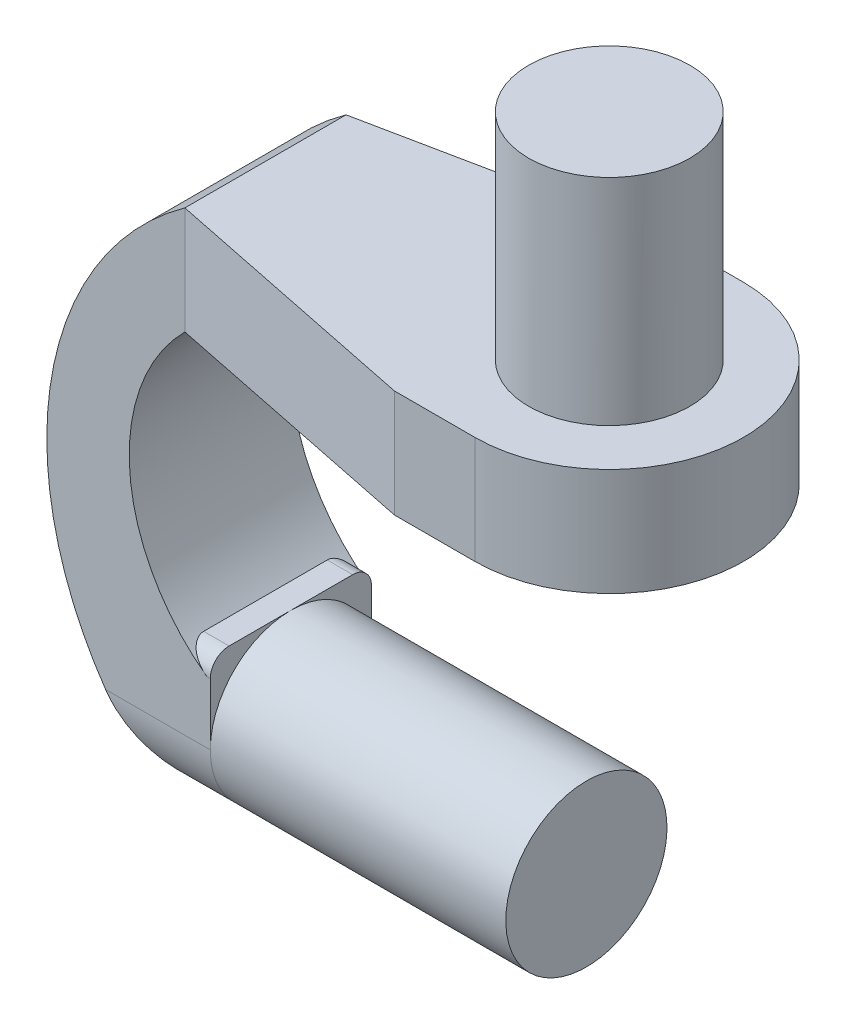
ISO-10303-21;
HEADER;
FILE_DESCRIPTION(('STEP AP214'),'2;1');
FILE_NAME('part.step','',(''),(''),'','','');
FILE_SCHEMA(('AUTOMOTIVE_DESIGN { 1 0 10303 214 1 1 1 1 }'));
ENDSEC;
DATA;
#1=APPLICATION_CONTEXT('core data for automotive mechanical design processes');
#2=APPLICATION_PROTOCOL_DEFINITION('international standard','automotive_design',2000,#1);
#3=PRODUCT_CONTEXT('',#1,'mechanical');
#4=PRODUCT('Part','Part','',(#3));
#5=PRODUCT_RELATED_PRODUCT_CATEGORY('part','',(#4));
#6=PRODUCT_DEFINITION_FORMATION('','',#4);
#7=PRODUCT_DEFINITION_CONTEXT('part definition',#1,'design');
#8=PRODUCT_DEFINITION('design','',#6,#7);
#9=PRODUCT_DEFINITION_SHAPE('','',#8);
#10=(LENGTH_UNIT() NAMED_UNIT(*) SI_UNIT(.MILLI.,.METRE.));
#11=(NAMED_UNIT(*) PLANE_ANGLE_UNIT() SI_UNIT($,.RADIAN.));
#12=(NAMED_UNIT(*) SI_UNIT($,.STERADIAN.) SOLID_ANGLE_UNIT());
#13=UNCERTAINTY_MEASURE_WITH_UNIT(LENGTH_MEASURE(1.E-05),#10,'distance_accuracy_value','');
#14=(GEOMETRIC_REPRESENTATION_CONTEXT(3) GLOBAL_UNCERTAINTY_ASSIGNED_CONTEXT((#13)) GLOBAL_UNIT_ASSIGNED_CONTEXT((#10,
#11,#12)) REPRESENTATION_CONTEXT('',''));
#15=CARTESIAN_POINT('',(0.,0.,0.));
#16=DIRECTION('',(0.,0.,1.));
#17=DIRECTION('',(1.,0.,0.));
#18=AXIS2_PLACEMENT_3D('',#15,#16,#17);
#19=CARTESIAN_POINT('',(4.73017455908226,0.,30.));
#20=DIRECTION('',(-1.,0.,0.));
#21=DIRECTION('',(0.,-1.,0.));
#22=AXIS2_PLACEMENT_3D('',#19,#20,#21);
#23=PLANE('',#22);
#24=DIRECTION('',(0.,0.,-1.));
#25=VECTOR('',#24,1.);
#26=CARTESIAN_POINT('',(4.73017455908226,0.,30.));
#27=LINE('',#26,#25);
#28=CARTESIAN_POINT('',(4.73017455908226,0.,26.5));
#29=VERTEX_POINT('',#28);
#30=CARTESIAN_POINT('',(4.73017455908226,0.,15.));
#31=VERTEX_POINT('',#30);
#32=EDGE_CURVE('E224',#29,#31,#27,.T.);
#33=ORIENTED_EDGE('',*,*,#32,.F.);
#34=CARTESIAN_POINT('',(4.73017455908226,-3.5,26.5));
#35=DIRECTION('',(-1.,0.,0.));
#36=DIRECTION('',(0.,-1.,0.));
#37=AXIS2_PLACEMENT_3D('',#34,#35,#36);
#38=CIRCLE('',#37,3.5);
#39=CARTESIAN_POINT('',(4.73017455908226,-3.5,30.));
#40=VERTEX_POINT('',#39);
#41=EDGE_CURVE('E243',#29,#40,#38,.F.);
#42=ORIENTED_EDGE('',*,*,#41,.T.);
#43=DIRECTION('',(0.,1.,0.));
#44=VECTOR('',#43,1.);
#45=CARTESIAN_POINT('',(4.73017455908226,0.,30.));
#46=LINE('',#45,#44);
#47=CARTESIAN_POINT('',(4.73017455908226,-15.,30.));
#48=VERTEX_POINT('',#47);
#49=EDGE_CURVE('E208',#48,#40,#46,.T.);
#50=ORIENTED_EDGE('',*,*,#49,.F.);
#51=CARTESIAN_POINT('',(4.73017455908226,-15.,15.));
#52=DIRECTION('',(1.,0.,0.));
#53=DIRECTION('',(0.,1.,0.));
#54=AXIS2_PLACEMENT_3D('',#51,#52,#53);
#55=CIRCLE('',#54,15.);
#56=EDGE_CURVE('E197',#31,#48,#55,.T.);
#57=ORIENTED_EDGE('',*,*,#56,.F.);
#58=EDGE_LOOP('',(#33,#42,#50,#57));
#59=FACE_BOUND('',#58,.T.);
#60=ADVANCED_FACE('F41',(#59),#23,.F.);
#61=CARTESIAN_POINT('',(25.,25.,30.));
#62=DIRECTION('',(0.,0.,-1.));
#63=DIRECTION('',(-1.,0.,0.));
#64=AXIS2_PLACEMENT_3D('',#61,#62,#63);
#65=CYLINDRICAL_SURFACE('',#64,35.3553390593274);
#66=CARTESIAN_POINT('',(25.,25.,0.));
#67=DIRECTION('',(0.,0.,-1.));
#68=DIRECTION('',(-1.,0.,0.));
#69=AXIS2_PLACEMENT_3D('',#66,#67,#68);
#70=CIRCLE('',#69,35.3553390593274);
#71=CARTESIAN_POINT('',(4.07752404709232,-3.5,0.));
#72=VERTEX_POINT('',#71);
#73=CARTESIAN_POINT('',(0.,50.,0.));
#74=VERTEX_POINT('',#73);
#75=EDGE_CURVE('E196',#72,#74,#70,.T.);
#76=ORIENTED_EDGE('',*,*,#75,.T.);
#77=DIRECTION('',(0.,0.,-1.));
#78=VECTOR('',#77,1.);
#79=CARTESIAN_POINT('',(0.,50.,30.));
#80=LINE('',#79,#78);
#81=CARTESIAN_POINT('',(0.,50.,30.));
#82=VERTEX_POINT('',#81);
#83=EDGE_CURVE('E229',#82,#74,#80,.T.);
#84=ORIENTED_EDGE('',*,*,#83,.F.);
#85=CARTESIAN_POINT('',(25.,25.,30.));
#86=DIRECTION('',(0.,0.,-1.));
#87=DIRECTION('',(-1.,0.,0.));
#88=AXIS2_PLACEMENT_3D('',#85,#86,#87);
#89=CIRCLE('',#88,35.3553390593274);
#90=CARTESIAN_POINT('',(4.07752404709232,-3.5,30.));
#91=VERTEX_POINT('',#90);
#92=EDGE_CURVE('E202',#91,#82,#89,.T.);
#93=ORIENTED_EDGE('',*,*,#92,.F.);
#94=CARTESIAN_POINT('',(4.07752404709232,-3.5,30.));
#95=CARTESIAN_POINT('',(3.98138738331284,-3.42942458306522,29.9999953331386));
#96=CARTESIAN_POINT('',(3.8856156408943,-3.35836691976016,29.9978654151781));
#97=CARTESIAN_POINT('',(3.69490324020333,-3.21536922700709,29.9891438972232));
#98=CARTESIAN_POINT('',(3.59996278947417,-3.14342898740317,29.9825512134984));
#99=CARTESIAN_POINT('',(3.31587017385924,-2.92589285679172,29.9556936083779));
#100=CARTESIAN_POINT('',(3.12820211373673,-2.77913616114215,29.9283457232254));
#101=CARTESIAN_POINT('',(2.75572240551768,-2.4818075208272,29.8521917490812));
#102=CARTESIAN_POINT('',(2.5709924349927,-2.3312111545292,29.8030782725758));
#103=CARTESIAN_POINT('',(2.2095899156695,-2.03057936225102,29.6807362563524));
#104=CARTESIAN_POINT('',(2.0329022941179,-1.88054341531848,29.6075551372409));
#105=CARTESIAN_POINT('',(1.77771020464601,-1.65966304374609,29.4782923430573));
#106=CARTESIAN_POINT('',(1.69509658416937,-1.58746231836202,29.4325298352264));
#107=CARTESIAN_POINT('',(1.53289223171498,-1.44440517463277,29.334091741339));
#108=CARTESIAN_POINT('',(1.45330159692469,-1.37354879954436,29.2814159332656));
#109=CARTESIAN_POINT('',(1.22038653271812,-1.16434909253484,29.112800582105));
#110=CARTESIAN_POINT('',(1.07217920951994,-1.02873272390833,28.9859097761856));
#111=CARTESIAN_POINT('',(0.819370781800552,-0.793830467938925,28.7252749385377));
#112=CARTESIAN_POINT('',(0.711667979499445,-0.692327168667741,28.5965565099821));
#113=CARTESIAN_POINT('',(0.5136952433472,-0.503715718845871,28.3167645852262));
#114=CARTESIAN_POINT('',(0.423411937760383,-0.4165965340823,28.16570839479));
#115=CARTESIAN_POINT('',(0.281842690977172,-0.278852642851255,27.8763325244754));
#116=CARTESIAN_POINT('',(0.226351289366165,-0.224406204840851,27.7418998358952));
#117=CARTESIAN_POINT('',(0.132241678591598,-0.13163323187503,27.4621392735744));
#118=CARTESIAN_POINT('',(0.0935896206377331,-0.0932743651216748,27.3168339507169));
#119=CARTESIAN_POINT('',(0.0432727203375999,-0.0432156659698818,27.0593608332615));
#120=CARTESIAN_POINT('',(0.0271292823993584,-0.0271047470416255,26.9489123027056));
#121=CARTESIAN_POINT('',(0.0108963756090021,-0.0108926975859752,26.7815831182821));
#122=CARTESIAN_POINT('',(0.00681567922463498,-0.0068142811705022,26.725438952235));
#123=CARTESIAN_POINT('',(0.00136555582780911,-0.00136561544977088,26.6128680771393));
#124=CARTESIAN_POINT('',(-2.88679567981159E-06,3.65059255079361E-06,26.5564412729559));
#125=CARTESIAN_POINT('',(0.,0.,26.5));
#126=B_SPLINE_CURVE_WITH_KNOTS('',3,(#94,#95,#96,#97,#98,#99,#100,#101,#102,#103,#104,#105,#106,
#107,#108,#109,#110,#111,#112,#113,#114,#115,#116,#117,#118,#119,#120,#121,#122,#123,#124,#125),
.UNSPECIFIED.,.F.,.F.,(4,2,2,2,2,2,2,2,2,2,2,2,2,2,2,4),(0.,0.357740129426834,0.71556716304623,
1.43402470188671,2.16296918956532,2.89048595340967,3.24689996314408,3.6033254217251,
4.31306540898095,4.89943040188353,5.4853434765923,5.94937621896781,6.41247185577119,
6.74978320508651,6.91898442704675,7.08824704788529),.UNSPECIFIED.);
#127=CARTESIAN_POINT('',(0.,0.,26.5));
#128=VERTEX_POINT('',#127);
#129=EDGE_CURVE('E254',#91,#128,#126,.T.);
#130=ORIENTED_EDGE('',*,*,#129,.T.);
#131=DIRECTION('',(0.,0.,-1.));
#132=VECTOR('',#131,1.);
#133=CARTESIAN_POINT('',(0.,0.,30.));
#134=LINE('',#133,#132);
#135=CARTESIAN_POINT('',(0.,0.,3.5));
#136=VERTEX_POINT('',#135);
#137=EDGE_CURVE('E211',#128,#136,#134,.T.);
#138=ORIENTED_EDGE('',*,*,#137,.T.);
#139=CARTESIAN_POINT('',(0.,0.,3.5));
#140=CARTESIAN_POINT('',(-1.55281885477549E-05,1.87808856252323E-05,3.42247872036869));
#141=CARTESIAN_POINT('',(0.00257498377828729,-0.00257491223823699,3.34497031451016));
#142=CARTESIAN_POINT('',(0.0128481703146678,-0.0128434861670845,3.19068078664446));
#143=CARTESIAN_POINT('',(0.0205274496090057,-0.0205149790106605,3.1138992143093));
#144=CARTESIAN_POINT('',(0.0407802853757086,-0.0407176772621466,2.96224582513414));
#145=CARTESIAN_POINT('',(0.0533157080079729,-0.0532110153879446,2.88736385662995));
#146=CARTESIAN_POINT('',(0.0830602400109421,-0.0827939752061581,2.73947464043919));
#147=CARTESIAN_POINT('',(0.100269886791045,-0.0998841254054866,2.66646760937681));
#148=CARTESIAN_POINT('',(0.158439537996554,-0.157501010472901,2.45136708014097));
#149=CARTESIAN_POINT('',(0.206010451881759,-0.20444488105733,2.31268572430238));
#150=CARTESIAN_POINT('',(0.316306311826561,-0.312471706775321,2.0473086144525));
#151=CARTESIAN_POINT('',(0.379061612909263,-0.373582973492562,1.9206375852355));
#152=CARTESIAN_POINT('',(0.542915805309272,-0.531710437274315,1.63594177591007));
#153=CARTESIAN_POINT('',(0.649587324678243,-0.633618597419721,1.48383408757272));
#154=CARTESIAN_POINT('',(0.88069363463394,-0.85119796628913,1.20539428459331));
#155=CARTESIAN_POINT('',(1.00515332790182,-0.966888431201438,1.07909891877637));
#156=CARTESIAN_POINT('',(1.32359997465509,-1.25817941843804,0.801812752990653));
#157=CARTESIAN_POINT('',(1.52452806166125,-1.43821029876506,0.663427025648555));
#158=CARTESIAN_POINT('',(1.83932990417509,-1.71335354267966,0.488392447095978));
#159=CARTESIAN_POINT('',(1.94678384897571,-1.80615544973914,0.435380317415902));
#160=CARTESIAN_POINT('',(2.16540559278941,-1.99262559802932,0.339493400696824));
#161=CARTESIAN_POINT('',(2.27657238801956,-2.08629360023435,0.296615898641265));
#162=CARTESIAN_POINT('',(2.5243122319694,-2.29238626887166,0.212691676194992));
#163=CARTESIAN_POINT('',(2.6615476893279,-2.40484290041651,0.173698350232292));
#164=CARTESIAN_POINT('',(2.93952917163843,-2.62910684073955,0.10806926498445));
#165=CARTESIAN_POINT('',(3.08027674129598,-2.74091383615804,0.0814390479408818));
#166=CARTESIAN_POINT('',(3.36270819776118,-2.96174718461249,0.0398319095955325));
#167=CARTESIAN_POINT('',(3.50435802110077,-3.07079082388116,0.0247125787397852));
#168=CARTESIAN_POINT('',(3.78958996076149,-3.28693376417426,0.0048152390050554));
#169=CARTESIAN_POINT('',(3.93316953731037,-3.39403525399173,2.47650469227096E-05));
#170=CARTESIAN_POINT('',(4.07752404709232,-3.5,0.));
#171=B_SPLINE_CURVE_WITH_KNOTS('',3,(#139,#140,#141,#142,#143,#144,#145,#146,#147,#148,#149,
#150,#151,#152,#153,#154,#155,#156,#157,#158,#159,#160,#161,#162,#163,#164,#165,#166,#167,#168,
#169,#170),.UNSPECIFIED.,.F.,.F.,(4,2,2,2,2,2,2,2,2,2,2,2,2,2,2,4),(0.,0.232456170049013,
0.464757399024964,0.695270251421364,0.925809617790403,1.38535501588275,1.84582679099065,
2.47797011224983,3.11100723689507,4.01528326335595,4.46969491959077,4.92398470286714,
5.46846339792871,6.01318594148473,6.55105461095497,7.08827380517089),.UNSPECIFIED.);
#172=EDGE_CURVE('E245',#136,#72,#171,.T.);
#173=ORIENTED_EDGE('',*,*,#172,.T.);
#174=EDGE_LOOP('',(#76,#84,#93,#130,#138,#173));
#175=FACE_BOUND('',#174,.T.);
#176=ADVANCED_FACE('F261',(#175),#65,.F.);
#177=CARTESIAN_POINT('',(35.8085185395878,20.,30.));
#178=DIRECTION('',(0.,0.,-1.));
#179=DIRECTION('',(-1.,0.,0.));
#180=AXIS2_PLACEMENT_3D('',#177,#178,#179);
#181=CYLINDRICAL_SURFACE('',#180,61.5);
#182=CARTESIAN_POINT('',(35.8085185395878,20.,0.));
#183=DIRECTION('',(0.,0.,1.));
#184=DIRECTION('',(1.,0.,0.));
#185=AXIS2_PLACEMENT_3D('',#182,#183,#184);
#186=CIRCLE('',#185,61.5);
#187=CARTESIAN_POINT('',(0.,70.,0.));
#188=VERTEX_POINT('',#187);
#189=CARTESIAN_POINT('',(-14.7607408973469,-15.,0.));
#190=VERTEX_POINT('',#189);
#191=EDGE_CURVE('E217',#188,#190,#186,.T.);
#192=ORIENTED_EDGE('',*,*,#191,.T.);
#193=CARTESIAN_POINT('',(-14.7607408973469,-15.,0.));
#194=CARTESIAN_POINT('',(-14.5792200229492,-15.2622740154124,4.30827258697492E-06));
#195=CARTESIAN_POINT('',(-14.3956843677024,-15.5230854188652,0.00687871256496888));
#196=CARTESIAN_POINT('',(-14.0249397877896,-16.041335452944,0.0339392670614126));
#197=CARTESIAN_POINT('',(-13.8377313669971,-16.298774538254,0.0541236034719172));
#198=CARTESIAN_POINT('',(-13.2714317129944,-17.0649607565935,0.133948977383458));
#199=CARTESIAN_POINT('',(-12.8873039289826,-17.5680998429091,0.212864112890832));
#200=CARTESIAN_POINT('',(-12.109171077569,-18.5556762213086,0.41879635796991));
#201=CARTESIAN_POINT('',(-11.7151744777037,-19.0401286973664,0.545773466678897));
#202=CARTESIAN_POINT('',(-10.9198221002023,-19.9886897900152,0.845129434459807));
#203=CARTESIAN_POINT('',(-10.5184647183866,-20.4527938954083,1.01751830246465));
#204=CARTESIAN_POINT('',(-9.70659702743813,-21.3642516364997,1.4079015095403));
#205=CARTESIAN_POINT('',(-9.29603483042673,-21.8113301552955,1.62642905704888));
#206=CARTESIAN_POINT('',(-8.47396202934319,-22.6810254965548,2.10625993358674));
#207=CARTESIAN_POINT('',(-8.06245138637646,-23.1036412965817,2.36756504878986));
#208=CARTESIAN_POINT('',(-7.2421077883039,-23.9229989050268,2.93236362429304));
#209=CARTESIAN_POINT('',(-6.83327629771808,-24.3197274768928,3.23587842254483));
#210=CARTESIAN_POINT('',(-6.02310277728024,-25.0852050685383,3.88512262754386));
#211=CARTESIAN_POINT('',(-5.62175869659526,-25.4539618373449,4.23084027307785));
#212=CARTESIAN_POINT('',(-4.94083321265541,-26.0639578745998,4.86464257493412));
#213=CARTESIAN_POINT('',(-4.65810124976161,-26.3123905133148,5.14245480075327));
#214=CARTESIAN_POINT('',(-4.10237519877665,-26.7921492208275,5.72170856540481));
#215=CARTESIAN_POINT('',(-3.82938127689508,-27.0234749977161,6.02315050727042));
#216=CARTESIAN_POINT('',(-3.29690674652528,-27.4672057705777,6.65037969203437));
#217=CARTESIAN_POINT('',(-3.03741319053763,-27.679629039276,6.97614285113294));
#218=CARTESIAN_POINT('',(-2.53632429164099,-28.0835388414981,7.65313235524456));
#219=CARTESIAN_POINT('',(-2.294722246163,-28.2750332283841,8.00434906620936));
#220=CARTESIAN_POINT('',(-1.74869822555839,-28.7018024254323,8.87035917078829));
#221=CARTESIAN_POINT('',(-1.45458238137089,-28.9266601981175,9.39719802538942));
#222=CARTESIAN_POINT('',(-1.0621593450361,-29.2222529347345,10.2237316520174));
#223=CARTESIAN_POINT('',(-0.939652921307565,-29.313708084602,10.5047529740322));
#224=CARTESIAN_POINT('',(-0.713439387551994,-29.4814746901261,11.0787484079608));
#225=CARTESIAN_POINT('',(-0.609730445642269,-29.5577876215154,11.3717213517331));
#226=CARTESIAN_POINT('',(-0.434994483403972,-29.6856933267681,11.9334974392492));
#227=CARTESIAN_POINT('',(-0.36156595710297,-29.7391315856048,12.2011316162009));
#228=CARTESIAN_POINT('',(-0.233769854561648,-29.8318139851036,12.7432598062404));
#229=CARTESIAN_POINT('',(-0.179395505784152,-29.8710631692283,13.0177513447375));
#230=CARTESIAN_POINT('',(-0.0908354008029242,-29.9348520014036,13.5752806383744));
#231=CARTESIAN_POINT('',(-0.0569083005968508,-29.9592032476735,13.8583821572965));
#232=CARTESIAN_POINT('',(-0.0228368829536855,-29.9836387104858,14.2851830657752));
#233=CARTESIAN_POINT('',(-0.0142828527342088,-29.9897686834676,14.4279272781284));
#234=CARTESIAN_POINT('',(-0.00286147843481455,-29.9979508309009,14.7137730483488));
#235=CARTESIAN_POINT('',(5.31801812459891E-06,-30.000002612661,14.8568746392999));
#236=CARTESIAN_POINT('',(0.,-30.,15.));
#237=B_SPLINE_CURVE_WITH_KNOTS('',3,(#193,#194,#195,#196,#197,#198,#199,#200,#201,#202,#203,
#204,#205,#206,#207,#208,#209,#210,#211,#212,#213,#214,#215,#216,#217,#218,#219,#220,#221,#222,
#223,#224,#225,#226,#227,#228,#229,#230,#231,#232,#233,#234,#235,#236),.UNSPECIFIED.,.F.,.F.,(4,
2,2,2,2,2,2,2,2,2,2,2,2,2,2,2,2,2,2,2,2,4),(0.,0.95670430992796,1.913278273165,3.82452441798732,
5.73418336231653,7.64426355576484,9.5777611809543,11.5113395597808,13.4458989836832,
15.3799205044302,16.7824277080587,18.1849588383409,19.5861190935327,20.9867517584164,
22.9112977394849,23.8701408790852,24.8288905256482,25.6757624129488,26.5223329856052,
27.3793993372266,27.8086442513817,28.2379304957683),.UNSPECIFIED.);
#238=CARTESIAN_POINT('',(0.,-30.,15.));
#239=VERTEX_POINT('',#238);
#240=EDGE_CURVE('E62',#190,#239,#237,.T.);
#241=ORIENTED_EDGE('',*,*,#240,.T.);
#242=CARTESIAN_POINT('',(0.,-30.,15.));
#243=CARTESIAN_POINT('',(3.91535603408932E-06,-30.0000019226519,15.1326603857099));
#244=CARTESIAN_POINT('',(-0.00245819959606967,-29.9982396128154,15.2653019020884));
#245=CARTESIAN_POINT('',(-0.012272834885369,-29.9912088150983,15.5303003796544));
#246=CARTESIAN_POINT('',(-0.0196249620021606,-29.9859406091372,15.6626573628635));
#247=CARTESIAN_POINT('',(-0.0489279016345173,-29.964929207615,16.0586041334327));
#248=CARTESIAN_POINT('',(-0.0781255051440818,-29.9439791003435,16.3214317477849));
#249=CARTESIAN_POINT('',(-0.154547859397388,-29.8889769314415,16.8400143838505));
#250=CARTESIAN_POINT('',(-0.201571071213078,-29.8550713137052,17.0958153816526));
#251=CARTESIAN_POINT('',(-0.312379018872984,-29.7748473362706,17.6018351823594));
#252=CARTESIAN_POINT('',(-0.376169440542922,-29.7285247658299,17.8520520603816));
#253=CARTESIAN_POINT('',(-0.537569118598636,-29.6107278604999,18.4099415454994));
#254=CARTESIAN_POINT('',(-0.639659353283302,-29.5358449420387,18.7156008630672));
#255=CARTESIAN_POINT('',(-0.864729870600318,-29.3694482196701,19.3145938666294));
#256=CARTESIAN_POINT('',(-0.987725606486511,-29.2779221096682,19.6079182331461));
#257=CARTESIAN_POINT('',(-1.25188771519556,-29.079564599993,20.1825337151424));
#258=CARTESIAN_POINT('',(-1.39313141845338,-28.9726678319304,20.4637664100265));
#259=CARTESIAN_POINT('',(-1.69033891690908,-28.745468621903,21.0125096204444));
#260=CARTESIAN_POINT('',(-1.84629909839459,-28.6251694696634,21.2800234799396));
#261=CARTESIAN_POINT('',(-2.25481730174869,-28.3066236419429,21.9374402106189));
#262=CARTESIAN_POINT('',(-2.51538407457947,-28.1004094518331,22.31852974207));
#263=CARTESIAN_POINT('',(-3.05731056585344,-27.6635990134213,23.0507860508791));
#264=CARTESIAN_POINT('',(-3.33868089440391,-27.4329902973803,23.4019373599993));
#265=CARTESIAN_POINT('',(-3.91699903891987,-26.9497120975835,24.0761581949266));
#266=CARTESIAN_POINT('',(-4.21397096166888,-26.6970080477087,24.3991820836882));
#267=CARTESIAN_POINT('',(-4.81870023765981,-26.1718487051831,25.0177020850703));
#268=CARTESIAN_POINT('',(-5.12645697992192,-25.8993945304817,25.3131997536433));
#269=CARTESIAN_POINT('',(-5.86617709960482,-25.2305499684779,25.9834630617058));
#270=CARTESIAN_POINT('',(-6.30146780532165,-24.8259761558389,26.346437402743));
#271=CARTESIAN_POINT('',(-7.17930812722109,-23.9848465009011,27.0234781092075));
#272=CARTESIAN_POINT('',(-7.62186030758822,-23.5482791637817,27.3375267683991));
#273=CARTESIAN_POINT('',(-8.5081851784751,-22.6459752961185,27.9161090704618));
#274=CARTESIAN_POINT('',(-8.95195558734896,-22.1802767442277,28.1807054603027));
#275=CARTESIAN_POINT('',(-9.83666361183539,-21.2212658850746,28.6595377427686));
#276=CARTESIAN_POINT('',(-10.2776018455175,-20.727959847849,28.8737850133583));
#277=CARTESIAN_POINT('',(-11.0663786676998,-19.8156089786057,29.2125905318895));
#278=CARTESIAN_POINT('',(-11.415446235767,-19.4010783286302,29.3465027477494));
#279=CARTESIAN_POINT('',(-12.1070595722643,-18.5570346505139,29.5787187353596));
#280=CARTESIAN_POINT('',(-12.4496071650935,-18.1275259116748,29.677032611143));
#281=CARTESIAN_POINT('',(-13.1264266112635,-17.2548790487242,29.836179969362));
#282=CARTESIAN_POINT('',(-13.4606955288162,-16.8117362111419,29.8970003334464));
#283=CARTESIAN_POINT('',(-13.9543099452759,-16.1384632990158,29.9584342322085));
#284=CARTESIAN_POINT('',(-14.1176184109699,-15.9125136348844,29.9739463432488));
#285=CARTESIAN_POINT('',(-14.4413806098179,-15.4580810894631,29.9947284706117));
#286=CARTESIAN_POINT('',(-14.6018340662219,-15.2295979660398,29.9999974993238));
#287=CARTESIAN_POINT('',(-14.7607408973468,-15.,30.));
#288=B_SPLINE_CURVE_WITH_KNOTS('',3,(#242,#243,#244,#245,#246,#247,#248,#249,#250,#251,#252,
#253,#254,#255,#256,#257,#258,#259,#260,#261,#262,#263,#264,#265,#266,#267,#268,#269,#270,#271,
#272,#273,#274,#275,#276,#277,#278,#279,#280,#281,#282,#283,#284,#285,#286,#287),.UNSPECIFIED.,
.F.,.F.,(4,2,2,2,2,2,2,2,2,2,2,2,2,2,2,2,2,2,2,2,2,2,4),(0.,0.397909631650282,0.795787270072938,
1.59046056992976,2.3764049184766,3.16261612840148,4.15364319859418,5.14540604312748,
6.1415187647107,7.13738751871556,8.65187314845857,10.1671365873264,11.6848144462172,
13.2024064644282,15.2886947288665,17.3757362771624,19.4601114556852,21.5440151502568,
23.2174084620863,24.8903264343414,26.5638294008338,27.401300806987,28.23885295587),.UNSPECIFIED.);
#289=CARTESIAN_POINT('',(-14.7607408973469,-15.,30.));
#290=VERTEX_POINT('',#289);
#291=EDGE_CURVE('E57',#239,#290,#288,.T.);
#292=ORIENTED_EDGE('',*,*,#291,.T.);
#293=CARTESIAN_POINT('',(35.8085185395878,20.,30.));
#294=DIRECTION('',(0.,0.,1.));
#295=DIRECTION('',(1.,0.,0.));
#296=AXIS2_PLACEMENT_3D('',#293,#294,#295);
#297=CIRCLE('',#296,61.5);
#298=CARTESIAN_POINT('',(0.,70.,30.));
#299=VERTEX_POINT('',#298);
#300=EDGE_CURVE('E206',#299,#290,#297,.T.);
#301=ORIENTED_EDGE('',*,*,#300,.F.);
#302=DIRECTION('',(0.,0.,-1.));
#303=VECTOR('',#302,1.);
#304=CARTESIAN_POINT('',(0.,70.,30.));
#305=LINE('',#304,#303);
#306=EDGE_CURVE('E226',#299,#188,#305,.T.);
#307=ORIENTED_EDGE('',*,*,#306,.T.);
#308=EDGE_LOOP('',(#192,#241,#292,#301,#307));
#309=FACE_BOUND('',#308,.T.);
#310=ADVANCED_FACE('F289',(#309),#181,.T.);
#311=DIRECTION('',(0.,1.,0.));
#312=VECTOR('',#311,1.);
#313=CARTESIAN_POINT('',(4.73017455908226,0.,0.));
#314=LINE('',#313,#312);
#315=CARTESIAN_POINT('',(4.73017455908226,-15.,0.));
#316=VERTEX_POINT('',#315);
#317=CARTESIAN_POINT('',(4.73017455908226,-3.5,0.));
#318=VERTEX_POINT('',#317);
#319=EDGE_CURVE('E204',#316,#318,#314,.T.);
#320=ORIENTED_EDGE('',*,*,#319,.T.);
#321=CARTESIAN_POINT('',(4.73017455908226,-3.5,3.5));
#322=DIRECTION('',(-1.,0.,0.));
#323=DIRECTION('',(0.,-1.,0.));
#324=AXIS2_PLACEMENT_3D('',#321,#322,#323);
#325=CIRCLE('',#324,3.5);
#326=CARTESIAN_POINT('',(4.73017455908226,0.,3.5));
#327=VERTEX_POINT('',#326);
#328=EDGE_CURVE('E238',#318,#327,#325,.F.);
#329=ORIENTED_EDGE('',*,*,#328,.T.);
#330=EDGE_CURVE('E223',#31,#327,#27,.T.);
#331=ORIENTED_EDGE('',*,*,#330,.F.);
#332=EDGE_CURVE('E201',#316,#31,#55,.T.);
#333=ORIENTED_EDGE('',*,*,#332,.F.);
#334=EDGE_LOOP('',(#320,#329,#331,#333));
#335=FACE_BOUND('',#334,.T.);
#336=ADVANCED_FACE('F293',(#335),#23,.F.);
#337=CARTESIAN_POINT('',(0.,0.,30.));
#338=DIRECTION('',(0.,-1.,0.));
#339=DIRECTION('',(0.,0.,-1.));
#340=AXIS2_PLACEMENT_3D('',#337,#338,#339);
#341=PLANE('',#340);
#342=ORIENTED_EDGE('',*,*,#330,.T.);
#343=DIRECTION('',(-1.,0.,0.));
#344=VECTOR('',#343,1.);
#345=CARTESIAN_POINT('',(0.,0.,3.5));
#346=LINE('',#345,#344);
#347=EDGE_CURVE('E233',#327,#136,#346,.T.);
#348=ORIENTED_EDGE('',*,*,#347,.T.);
#349=ORIENTED_EDGE('',*,*,#137,.F.);
#350=DIRECTION('',(-1.,0.,0.));
#351=VECTOR('',#350,1.);
#352=CARTESIAN_POINT('',(0.,0.,26.5));
#353=LINE('',#352,#351);
#354=EDGE_CURVE('E231',#128,#29,#353,.F.);
#355=ORIENTED_EDGE('',*,*,#354,.T.);
#356=ORIENTED_EDGE('',*,*,#32,.T.);
#357=EDGE_LOOP('',(#342,#348,#349,#355,#356));
#358=FACE_BOUND('',#357,.T.);
#359=ADVANCED_FACE('F297',(#358),#341,.F.);
#360=CARTESIAN_POINT('',(25.,25.,30.));
#361=DIRECTION('',(0.,0.,-1.));
#362=DIRECTION('',(-1.,0.,0.));
#363=AXIS2_PLACEMENT_3D('',#360,#361,#362);
#364=PLANE('',#363);
#365=ORIENTED_EDGE('',*,*,#300,.T.);
#366=DIRECTION('',(1.,0.,0.));
#367=VECTOR('',#366,1.);
#368=CARTESIAN_POINT('',(25.,-15.,30.));
#369=LINE('',#368,#367);
#370=EDGE_CURVE('E50',#290,#48,#369,.T.);
#371=ORIENTED_EDGE('',*,*,#370,.T.);
#372=ORIENTED_EDGE('',*,*,#49,.T.);
#373=DIRECTION('',(-1.,0.,0.));
#374=VECTOR('',#373,1.);
#375=CARTESIAN_POINT('',(25.,-3.5,30.));
#376=LINE('',#375,#374);
#377=EDGE_CURVE('E240',#40,#91,#376,.T.);
#378=ORIENTED_EDGE('',*,*,#377,.T.);
#379=ORIENTED_EDGE('',*,*,#92,.T.);
#380=DIRECTION('',(0.,1.,0.));
#381=VECTOR('',#380,1.);
#382=CARTESIAN_POINT('',(0.,50.,30.));
#383=LINE('',#382,#381);
#384=EDGE_CURVE('E164',#82,#299,#383,.T.);
#385=ORIENTED_EDGE('',*,*,#384,.T.);
#386=EDGE_LOOP('',(#365,#371,#372,#378,#379,#385));
#387=FACE_BOUND('',#386,.T.);
#388=ADVANCED_FACE('F301',(#387),#364,.F.);
#389=CARTESIAN_POINT('',(25.,25.,0.));
#390=DIRECTION('',(0.,0.,-1.));
#391=DIRECTION('',(-1.,0.,0.));
#392=AXIS2_PLACEMENT_3D('',#389,#390,#391);
#393=PLANE('',#392);
#394=ORIENTED_EDGE('',*,*,#319,.F.);
#395=DIRECTION('',(1.,0.,0.));
#396=VECTOR('',#395,1.);
#397=CARTESIAN_POINT('',(0.,-15.,0.));
#398=LINE('',#397,#396);
#399=EDGE_CURVE('E376',#316,#190,#398,.F.);
#400=ORIENTED_EDGE('',*,*,#399,.T.);
#401=ORIENTED_EDGE('',*,*,#191,.F.);
#402=DIRECTION('',(0.,1.,0.));
#403=VECTOR('',#402,1.);
#404=CARTESIAN_POINT('',(0.,50.,0.));
#405=LINE('',#404,#403);
#406=EDGE_CURVE('E214',#74,#188,#405,.T.);
#407=ORIENTED_EDGE('',*,*,#406,.F.);
#408=ORIENTED_EDGE('',*,*,#75,.F.);
#409=DIRECTION('',(-1.,0.,0.));
#410=VECTOR('',#409,1.);
#411=CARTESIAN_POINT('',(4.73017455908226,-3.5,0.));
#412=LINE('',#411,#410);
#413=EDGE_CURVE('E236',#72,#318,#412,.F.);
#414=ORIENTED_EDGE('',*,*,#413,.T.);
#415=EDGE_LOOP('',(#394,#400,#401,#407,#408,#414));
#416=FACE_BOUND('',#415,.T.);
#417=ADVANCED_FACE('F303',(#416),#393,.T.);
#418=CARTESIAN_POINT('',(59.7301745590823,-15.,15.));
#419=DIRECTION('',(-1.,0.,0.));
#420=DIRECTION('',(0.,-1.,0.));
#421=AXIS2_PLACEMENT_3D('',#418,#419,#420);
#422=CYLINDRICAL_SURFACE('',#421,15.);
#423=CARTESIAN_POINT('',(59.7301745590823,-15.,15.));
#424=DIRECTION('',(1.,0.,0.));
#425=DIRECTION('',(0.,1.,0.));
#426=AXIS2_PLACEMENT_3D('',#423,#424,#425);
#427=CIRCLE('',#426,15.);
#428=CARTESIAN_POINT('',(59.7301745590823,0.,15.));
#429=VERTEX_POINT('',#428);
#430=EDGE_CURVE('E193',#429,#429,#427,.T.);
#431=ORIENTED_EDGE('',*,*,#430,.F.);
#432=EDGE_LOOP('',(#431));
#433=FACE_BOUND('',#432,.T.);
#434=ORIENTED_EDGE('',*,*,#56,.T.);
#435=CARTESIAN_POINT('',(4.73017455908226,-30.,15.));
#436=VERTEX_POINT('',#435);
#437=EDGE_CURVE('E200',#48,#436,#55,.T.);
#438=ORIENTED_EDGE('',*,*,#437,.T.);
#439=EDGE_CURVE('E373',#436,#316,#55,.T.);
#440=ORIENTED_EDGE('',*,*,#439,.T.);
#441=ORIENTED_EDGE('',*,*,#332,.T.);
#442=EDGE_LOOP('',(#434,#438,#440,#441));
#443=FACE_BOUND('',#442,.T.);
#444=ADVANCED_FACE('F306',(#433,#443),#422,.T.);
#445=CARTESIAN_POINT('',(59.7301745590823,-15.,15.));
#446=DIRECTION('',(1.,0.,0.));
#447=DIRECTION('',(0.,1.,0.));
#448=AXIS2_PLACEMENT_3D('',#445,#446,#447);
#449=PLANE('',#448);
#450=ORIENTED_EDGE('',*,*,#430,.T.);
#451=EDGE_LOOP('',(#450));
#452=FACE_BOUND('',#451,.T.);
#453=ADVANCED_FACE('F268',(#452),#449,.T.);
#454=CARTESIAN_POINT('',(0.,-3.5,3.5));
#455=DIRECTION('',(1.,0.,0.));
#456=DIRECTION('',(0.,0.,-1.));
#457=AXIS2_PLACEMENT_3D('',#454,#455,#456);
#458=CYLINDRICAL_SURFACE('',#457,3.5);
#459=ORIENTED_EDGE('',*,*,#328,.F.);
#460=ORIENTED_EDGE('',*,*,#413,.F.);
#461=ORIENTED_EDGE('',*,*,#172,.F.);
#462=ORIENTED_EDGE('',*,*,#347,.F.);
#463=EDGE_LOOP('',(#459,#460,#461,#462));
#464=FACE_BOUND('',#463,.T.);
#465=ADVANCED_FACE('F264',(#464),#458,.T.);
#466=CARTESIAN_POINT('',(25.,-3.5,26.5));
#467=DIRECTION('',(-1.,0.,0.));
#468=DIRECTION('',(0.,0.,1.));
#469=AXIS2_PLACEMENT_3D('',#466,#467,#468);
#470=CYLINDRICAL_SURFACE('',#469,3.5);
#471=ORIENTED_EDGE('',*,*,#41,.F.);
#472=ORIENTED_EDGE('',*,*,#354,.F.);
#473=ORIENTED_EDGE('',*,*,#129,.F.);
#474=ORIENTED_EDGE('',*,*,#377,.F.);
#475=EDGE_LOOP('',(#471,#472,#473,#474));
#476=FACE_BOUND('',#475,.T.);
#477=ADVANCED_FACE('F267',(#476),#470,.T.);
#478=CARTESIAN_POINT('',(25.,-15.,15.));
#479=DIRECTION('',(1.,0.,0.));
#480=DIRECTION('',(0.,0.,-1.));
#481=AXIS2_PLACEMENT_3D('',#478,#479,#480);
#482=CYLINDRICAL_SURFACE('',#481,15.);
#483=ORIENTED_EDGE('',*,*,#370,.F.);
#484=ORIENTED_EDGE('',*,*,#291,.F.);
#485=DIRECTION('',(1.,0.,0.));
#486=VECTOR('',#485,1.);
#487=CARTESIAN_POINT('',(0.,-30.,15.));
#488=LINE('',#487,#486);
#489=EDGE_CURVE('E189',#436,#239,#488,.F.);
#490=ORIENTED_EDGE('',*,*,#489,.F.);
#491=ORIENTED_EDGE('',*,*,#437,.F.);
#492=EDGE_LOOP('',(#483,#484,#490,#491));
#493=FACE_BOUND('',#492,.T.);
#494=ADVANCED_FACE('F43',(#493),#482,.T.);
#495=CARTESIAN_POINT('',(0.,-15.,15.));
#496=DIRECTION('',(-1.,0.,0.));
#497=DIRECTION('',(0.,0.,1.));
#498=AXIS2_PLACEMENT_3D('',#495,#496,#497);
#499=CYLINDRICAL_SURFACE('',#498,15.);
#500=ORIENTED_EDGE('',*,*,#240,.F.);
#501=ORIENTED_EDGE('',*,*,#399,.F.);
#502=ORIENTED_EDGE('',*,*,#439,.F.);
#503=ORIENTED_EDGE('',*,*,#489,.T.);
#504=EDGE_LOOP('',(#500,#501,#502,#503));
#505=FACE_BOUND('',#504,.T.);
#506=ADVANCED_FACE('F273',(#505),#499,.T.);
#507=CARTESIAN_POINT('',(0.,50.,0.));
#508=DIRECTION('',(-0.2,0.,-0.979795897113271));
#509=DIRECTION('',(-0.979795897113271,0.,0.2));
#510=AXIS2_PLACEMENT_3D('',#507,#508,#509);
#511=PLANE('',#510);
#512=DIRECTION('',(-0.979795897113271,0.,0.2));
#513=VECTOR('',#512,1.);
#514=CARTESIAN_POINT('',(0.,70.,0.));
#515=LINE('',#514,#513);
#516=CARTESIAN_POINT('',(48.9897948556636,70.,-10.));
#517=VERTEX_POINT('',#516);
#518=EDGE_CURVE('E165',#517,#188,#515,.T.);
#519=ORIENTED_EDGE('',*,*,#518,.F.);
#520=DIRECTION('',(0.,1.,0.));
#521=VECTOR('',#520,1.);
#522=CARTESIAN_POINT('',(48.9897948556636,50.,-10.));
#523=LINE('',#522,#521);
#524=CARTESIAN_POINT('',(48.9897948556636,50.,-10.));
#525=VERTEX_POINT('',#524);
#526=EDGE_CURVE('E187',#525,#517,#523,.T.);
#527=ORIENTED_EDGE('',*,*,#526,.F.);
#528=DIRECTION('',(-0.979795897113271,0.,0.2));
#529=VECTOR('',#528,1.);
#530=CARTESIAN_POINT('',(0.,50.,0.));
#531=LINE('',#530,#529);
#532=EDGE_CURVE('E150',#525,#74,#531,.T.);
#533=ORIENTED_EDGE('',*,*,#532,.T.);
#534=ORIENTED_EDGE('',*,*,#406,.T.);
#535=EDGE_LOOP('',(#519,#527,#533,#534));
#536=FACE_BOUND('',#535,.T.);
#537=ADVANCED_FACE('F276',(#536),#511,.T.);
#538=CARTESIAN_POINT('',(48.9897948556636,50.,-10.));
#539=DIRECTION('',(0.,0.,-1.));
#540=DIRECTION('',(-1.,0.,0.));
#541=AXIS2_PLACEMENT_3D('',#538,#539,#540);
#542=PLANE('',#541);
#543=DIRECTION('',(-1.,0.,0.));
#544=VECTOR('',#543,1.);
#545=CARTESIAN_POINT('',(48.9897948556636,70.,-10.));
#546=LINE('',#545,#544);
#547=CARTESIAN_POINT('',(63.9897948556636,70.,-10.));
#548=VERTEX_POINT('',#547);
#549=EDGE_CURVE('E168',#548,#517,#546,.T.);
#550=ORIENTED_EDGE('',*,*,#549,.F.);
#551=DIRECTION('',(0.,1.,0.));
#552=VECTOR('',#551,1.);
#553=CARTESIAN_POINT('',(63.9897948556636,50.,-10.));
#554=LINE('',#553,#552);
#555=CARTESIAN_POINT('',(63.9897948556636,50.,-10.));
#556=VERTEX_POINT('',#555);
#557=EDGE_CURVE('E190',#556,#548,#554,.T.);
#558=ORIENTED_EDGE('',*,*,#557,.F.);
#559=DIRECTION('',(-1.,0.,0.));
#560=VECTOR('',#559,1.);
#561=CARTESIAN_POINT('',(48.9897948556636,50.,-10.));
#562=LINE('',#561,#560);
#563=EDGE_CURVE('E174',#556,#525,#562,.T.);
#564=ORIENTED_EDGE('',*,*,#563,.T.);
#565=ORIENTED_EDGE('',*,*,#526,.T.);
#566=EDGE_LOOP('',(#550,#558,#564,#565));
#567=FACE_BOUND('',#566,.T.);
#568=ADVANCED_FACE('F324',(#567),#542,.T.);
#569=CARTESIAN_POINT('',(63.9897948556636,50.,15.));
#570=DIRECTION('',(0.,1.,0.));
#571=DIRECTION('',(0.,0.,1.));
#572=AXIS2_PLACEMENT_3D('',#569,#570,#571);
#573=CYLINDRICAL_SURFACE('',#572,25.);
#574=CARTESIAN_POINT('',(63.9897948556636,70.,15.));
#575=DIRECTION('',(0.,1.,0.));
#576=DIRECTION('',(0.,0.,-1.));
#577=AXIS2_PLACEMENT_3D('',#574,#575,#576);
#578=CIRCLE('',#577,25.);
#579=CARTESIAN_POINT('',(63.9897948556636,70.,40.));
#580=VERTEX_POINT('',#579);
#581=EDGE_CURVE('E182',#580,#548,#578,.T.);
#582=ORIENTED_EDGE('',*,*,#581,.F.);
#583=DIRECTION('',(0.,1.,0.));
#584=VECTOR('',#583,1.);
#585=CARTESIAN_POINT('',(63.9897948556636,50.,40.));
#586=LINE('',#585,#584);
#587=CARTESIAN_POINT('',(63.9897948556636,50.,40.));
#588=VERTEX_POINT('',#587);
#589=EDGE_CURVE('E149',#588,#580,#586,.T.);
#590=ORIENTED_EDGE('',*,*,#589,.F.);
#591=CARTESIAN_POINT('',(63.9897948556636,50.,15.));
#592=DIRECTION('',(0.,1.,0.));
#593=DIRECTION('',(0.,0.,-1.));
#594=AXIS2_PLACEMENT_3D('',#591,#592,#593);
#595=CIRCLE('',#594,25.);
#596=EDGE_CURVE('E160',#588,#556,#595,.T.);
#597=ORIENTED_EDGE('',*,*,#596,.T.);
#598=ORIENTED_EDGE('',*,*,#557,.T.);
#599=EDGE_LOOP('',(#582,#590,#597,#598));
#600=FACE_BOUND('',#599,.T.);
#601=ADVANCED_FACE('F321',(#600),#573,.T.);
#602=CARTESIAN_POINT('',(48.9897948556636,50.,40.));
#603=DIRECTION('',(0.,0.,1.));
#604=DIRECTION('',(1.,0.,0.));
#605=AXIS2_PLACEMENT_3D('',#602,#603,#604);
#606=PLANE('',#605);
#607=DIRECTION('',(1.,0.,0.));
#608=VECTOR('',#607,1.);
#609=CARTESIAN_POINT('',(48.9897948556636,70.,40.));
#610=LINE('',#609,#608);
#611=CARTESIAN_POINT('',(48.9897948556636,70.,40.));
#612=VERTEX_POINT('',#611);
#613=EDGE_CURVE('E144',#612,#580,#610,.T.);
#614=ORIENTED_EDGE('',*,*,#613,.F.);
#615=DIRECTION('',(0.,1.,0.));
#616=VECTOR('',#615,1.);
#617=CARTESIAN_POINT('',(48.9897948556636,50.,40.));
#618=LINE('',#617,#616);
#619=CARTESIAN_POINT('',(48.9897948556636,50.,40.));
#620=VERTEX_POINT('',#619);
#621=EDGE_CURVE('E139',#620,#612,#618,.T.);
#622=ORIENTED_EDGE('',*,*,#621,.F.);
#623=DIRECTION('',(1.,0.,0.));
#624=VECTOR('',#623,1.);
#625=CARTESIAN_POINT('',(48.9897948556636,50.,40.));
#626=LINE('',#625,#624);
#627=EDGE_CURVE('E142',#620,#588,#626,.T.);
#628=ORIENTED_EDGE('',*,*,#627,.T.);
#629=ORIENTED_EDGE('',*,*,#589,.T.);
#630=EDGE_LOOP('',(#614,#622,#628,#629));
#631=FACE_BOUND('',#630,.T.);
#632=ADVANCED_FACE('F141',(#631),#606,.T.);
#633=CARTESIAN_POINT('',(0.,50.,30.));
#634=DIRECTION('',(-0.2,0.,0.979795897113271));
#635=DIRECTION('',(0.979795897113271,0.,0.2));
#636=AXIS2_PLACEMENT_3D('',#633,#634,#635);
#637=PLANE('',#636);
#638=DIRECTION('',(0.979795897113271,0.,0.2));
#639=VECTOR('',#638,1.);
#640=CARTESIAN_POINT('',(0.,70.,30.));
#641=LINE('',#640,#639);
#642=EDGE_CURVE('E179',#299,#612,#641,.T.);
#643=ORIENTED_EDGE('',*,*,#642,.F.);
#644=ORIENTED_EDGE('',*,*,#384,.F.);
#645=DIRECTION('',(0.979795897113271,0.,0.2));
#646=VECTOR('',#645,1.);
#647=CARTESIAN_POINT('',(0.,50.,30.));
#648=LINE('',#647,#646);
#649=EDGE_CURVE('E157',#82,#620,#648,.T.);
#650=ORIENTED_EDGE('',*,*,#649,.T.);
#651=ORIENTED_EDGE('',*,*,#621,.T.);
#652=EDGE_LOOP('',(#643,#644,#650,#651));
#653=FACE_BOUND('',#652,.T.);
#654=ADVANCED_FACE('F163',(#653),#637,.T.);
#655=CARTESIAN_POINT('',(63.9897948556636,50.,15.));
#656=DIRECTION('',(0.,-1.,0.));
#657=DIRECTION('',(0.,0.,-1.));
#658=AXIS2_PLACEMENT_3D('',#655,#656,#657);
#659=PLANE('',#658);
#660=ORIENTED_EDGE('',*,*,#83,.T.);
#661=ORIENTED_EDGE('',*,*,#532,.F.);
#662=ORIENTED_EDGE('',*,*,#563,.F.);
#663=ORIENTED_EDGE('',*,*,#596,.F.);
#664=ORIENTED_EDGE('',*,*,#627,.F.);
#665=ORIENTED_EDGE('',*,*,#649,.F.);
#666=EDGE_LOOP('',(#660,#661,#662,#663,#664,#665));
#667=FACE_BOUND('',#666,.T.);
#668=ADVANCED_FACE('F156',(#667),#659,.T.);
#669=CARTESIAN_POINT('',(63.9897948556636,70.,15.));
#670=DIRECTION('',(0.,-1.,0.));
#671=DIRECTION('',(0.,0.,-1.));
#672=AXIS2_PLACEMENT_3D('',#669,#670,#671);
#673=PLANE('',#672);
#674=CARTESIAN_POINT('',(63.9897948556636,70.,15.));
#675=DIRECTION('',(0.,-1.,0.));
#676=DIRECTION('',(0.,0.,-1.));
#677=AXIS2_PLACEMENT_3D('',#674,#675,#676);
#678=CIRCLE('',#677,15.);
#679=CARTESIAN_POINT('',(63.9897948556636,70.,0.));
#680=VERTEX_POINT('',#679);
#681=EDGE_CURVE('E11',#680,#680,#678,.F.);
#682=ORIENTED_EDGE('',*,*,#681,.F.);
#683=EDGE_LOOP('',(#682));
#684=FACE_BOUND('',#683,.T.);
#685=ORIENTED_EDGE('',*,*,#306,.F.);
#686=ORIENTED_EDGE('',*,*,#642,.T.);
#687=ORIENTED_EDGE('',*,*,#613,.T.);
#688=ORIENTED_EDGE('',*,*,#581,.T.);
#689=ORIENTED_EDGE('',*,*,#549,.T.);
#690=ORIENTED_EDGE('',*,*,#518,.T.);
#691=EDGE_LOOP('',(#685,#686,#687,#688,#689,#690));
#692=FACE_BOUND('',#691,.T.);
#693=ADVANCED_FACE('F332',(#684,#692),#673,.F.);
#694=CARTESIAN_POINT('',(63.9897948556636,110.,15.));
#695=DIRECTION('',(0.,-1.,0.));
#696=DIRECTION('',(0.,0.,-1.));
#697=AXIS2_PLACEMENT_3D('',#694,#695,#696);
#698=CYLINDRICAL_SURFACE('',#697,15.);
#699=CARTESIAN_POINT('',(63.9897948556636,110.,15.));
#700=DIRECTION('',(0.,1.,0.));
#701=DIRECTION('',(0.,0.,1.));
#702=AXIS2_PLACEMENT_3D('',#699,#700,#701);
#703=CIRCLE('',#702,15.);
#704=CARTESIAN_POINT('',(63.9897948556636,110.,30.));
#705=VERTEX_POINT('',#704);
#706=EDGE_CURVE('E171',#705,#705,#703,.T.);
#707=ORIENTED_EDGE('',*,*,#706,.F.);
#708=EDGE_LOOP('',(#707));
#709=FACE_BOUND('',#708,.T.);
#710=ORIENTED_EDGE('',*,*,#681,.T.);
#711=EDGE_LOOP('',(#710));
#712=FACE_BOUND('',#711,.T.);
#713=ADVANCED_FACE('F335',(#709,#712),#698,.T.);
#714=CARTESIAN_POINT('',(63.9897948556636,110.,15.));
#715=DIRECTION('',(0.,1.,0.));
#716=DIRECTION('',(0.,0.,1.));
#717=AXIS2_PLACEMENT_3D('',#714,#715,#716);
#718=PLANE('',#717);
#719=ORIENTED_EDGE('',*,*,#706,.T.);
#720=EDGE_LOOP('',(#719));
#721=FACE_BOUND('',#720,.T.);
#722=ADVANCED_FACE('F341',(#721),#718,.T.);
#723=CLOSED_SHELL('',(#60,#176,#310,#336,#359,#388,#417,#444,#453,#465,#477,#494,#506,#537,#568,
#601,#632,#654,#668,#693,#713,#722));
#724=MANIFOLD_SOLID_BREP('B2',#723);
#725=ADVANCED_BREP_SHAPE_REPRESENTATION('',(#18,#724),#14);
#726=SHAPE_DEFINITION_REPRESENTATION(#9,#725);
ENDSEC;
END-ISO-10303-21;
